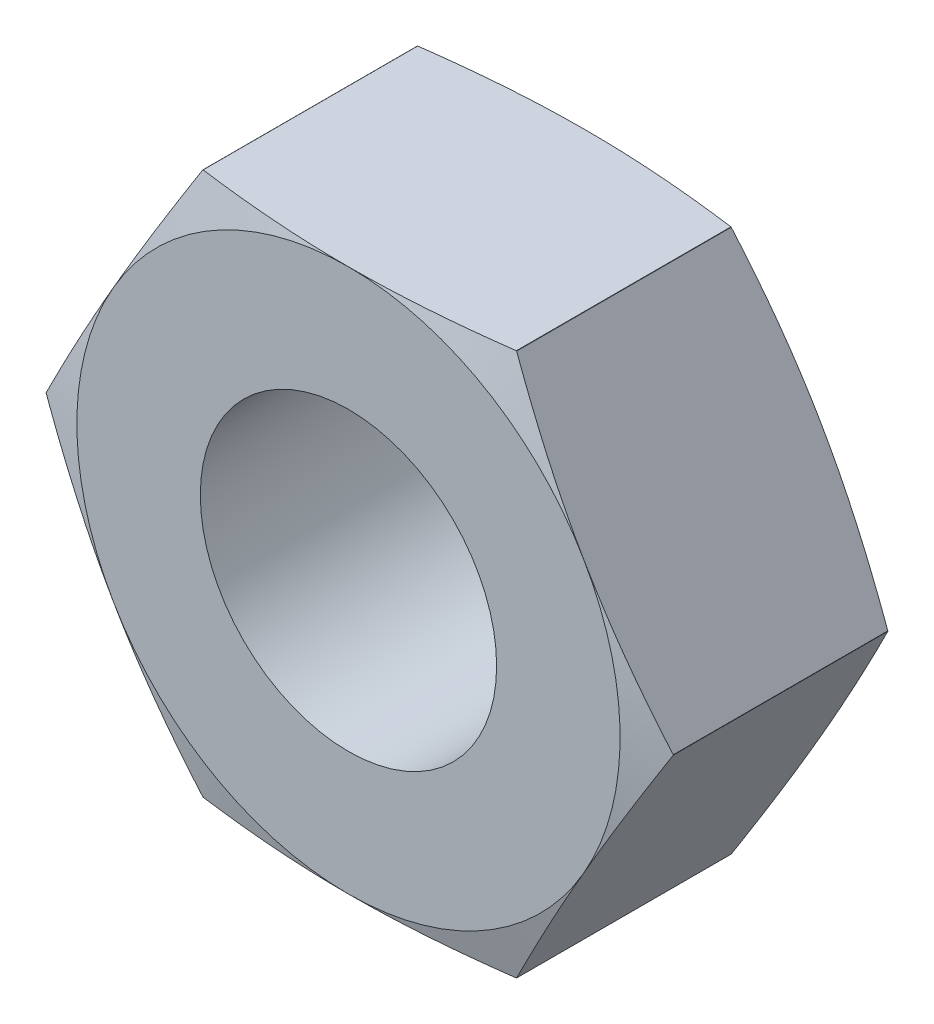
ISO-10303-21;
HEADER;
FILE_DESCRIPTION(('STEP AP214'),'2;1');
FILE_NAME('part.step','',(''),(''),'','','');
FILE_SCHEMA(('AUTOMOTIVE_DESIGN { 1 0 10303 214 1 1 1 1 }'));
ENDSEC;
DATA;
#1=APPLICATION_CONTEXT('core data for automotive mechanical design processes');
#2=APPLICATION_PROTOCOL_DEFINITION('international standard','automotive_design',2000,#1);
#3=PRODUCT_CONTEXT('',#1,'mechanical');
#4=PRODUCT('Part','Part','',(#3));
#5=PRODUCT_RELATED_PRODUCT_CATEGORY('part','',(#4));
#6=PRODUCT_DEFINITION_FORMATION('','',#4);
#7=PRODUCT_DEFINITION_CONTEXT('part definition',#1,'design');
#8=PRODUCT_DEFINITION('design','',#6,#7);
#9=PRODUCT_DEFINITION_SHAPE('','',#8);
#10=(LENGTH_UNIT() NAMED_UNIT(*) SI_UNIT(.MILLI.,.METRE.));
#11=(NAMED_UNIT(*) PLANE_ANGLE_UNIT() SI_UNIT($,.RADIAN.));
#12=(NAMED_UNIT(*) SI_UNIT($,.STERADIAN.) SOLID_ANGLE_UNIT());
#13=UNCERTAINTY_MEASURE_WITH_UNIT(LENGTH_MEASURE(1.E-05),#10,'distance_accuracy_value','');
#14=(GEOMETRIC_REPRESENTATION_CONTEXT(3) GLOBAL_UNCERTAINTY_ASSIGNED_CONTEXT((#13)) GLOBAL_UNIT_ASSIGNED_CONTEXT((#10,
#11,#12)) REPRESENTATION_CONTEXT('',''));
#15=CARTESIAN_POINT('',(0.,0.,0.));
#16=DIRECTION('',(0.,0.,1.));
#17=DIRECTION('',(1.,0.,0.));
#18=AXIS2_PLACEMENT_3D('',#15,#16,#17);
#19=CARTESIAN_POINT('',(0.,0.,-279.2));
#20=DIRECTION('',(0.,0.,-1.));
#21=DIRECTION('',(1.,0.,0.));
#22=AXIS2_PLACEMENT_3D('',#19,#20,#21);
#23=CONICAL_SURFACE('',#22,2.75,1.308408001851);
#24=CARTESIAN_POINT('',(3.17442600725103,0.00173287057355642,-279.313992681729));
#25=CARTESIAN_POINT('',(2.74959778509524,0.73755693583616,-279.199999998947));
#26=CARTESIAN_POINT('',(2.38156985368588,1.37500001164131,-279.199999999914));
#27=(BOUNDED_CURVE() B_SPLINE_CURVE(2,(#24,#25,#26),.UNSPECIFIED.,.F.,
.F.) B_SPLINE_CURVE_WITH_KNOTS((3,3),(0.,1.),
.UNSPECIFIED.) CURVE() GEOMETRIC_REPRESENTATION_ITEM() RATIONAL_B_SPLINE_CURVE((1.,
1.03786726143384,1.)) REPRESENTATION_ITEM(''));
#28=CARTESIAN_POINT('',(3.174426007569,0.001732870021516,-279.3139926819));
#29=VERTEX_POINT('',#28);
#30=CARTESIAN_POINT('',(2.381569853846,1.375000011364,-279.2));
#31=VERTEX_POINT('',#30);
#32=EDGE_CURVE('E403',#29,#31,#27,.T.);
#33=ORIENTED_EDGE('',*,*,#32,.T.);
#34=CARTESIAN_POINT('',(0.,0.,-279.2));
#35=DIRECTION('',(0.,0.,-1.));
#36=DIRECTION('',(0.866025401398437,0.500000004132675,0.));
#37=AXIS2_PLACEMENT_3D('',#34,#35,#36);
#38=CIRCLE('',#37,2.75);
#39=CARTESIAN_POINT('',(2.381569853846,-1.375000011364,-279.2));
#40=VERTEX_POINT('',#39);
#41=EDGE_CURVE('E241',#31,#40,#38,.T.);
#42=ORIENTED_EDGE('',*,*,#41,.T.);
#43=CARTESIAN_POINT('',(2.3815698540061,-1.37500001108668,-279.199999999914));
#44=CARTESIAN_POINT('',(2.74959778543771,-0.737556935242983,-279.199999998994));
#45=CARTESIAN_POINT('',(3.17442600767584,-0.00173286983775878,-279.313992681843));
#46=(BOUNDED_CURVE() B_SPLINE_CURVE(2,(#43,#44,#45),.UNSPECIFIED.,.F.,
.F.) B_SPLINE_CURVE_WITH_KNOTS((3,3),(0.,1.),
.UNSPECIFIED.) CURVE() GEOMETRIC_REPRESENTATION_ITEM() RATIONAL_B_SPLINE_CURVE((1.,
1.03786726143959,1.)) REPRESENTATION_ITEM(''));
#47=CARTESIAN_POINT('',(3.174426007569,-0.00173287002163,-279.3139926819));
#48=VERTEX_POINT('',#47);
#49=EDGE_CURVE('E355',#40,#48,#46,.T.);
#50=ORIENTED_EDGE('',*,*,#49,.T.);
#51=CARTESIAN_POINT('',(0.,0.,-279.3139926819));
#52=DIRECTION('',(0.,0.,-1.));
#53=DIRECTION('',(0.999999851005078,0.000545884439975143,0.));
#54=AXIS2_PLACEMENT_3D('',#51,#52,#53);
#55=CIRCLE('',#54,3.174426480543);
#56=EDGE_CURVE('E391',#29,#48,#55,.T.);
#57=ORIENTED_EDGE('',*,*,#56,.F.);
#58=EDGE_LOOP('',(#33,#42,#50,#57));
#59=FACE_BOUND('',#58,.T.);
#60=ADVANCED_FACE('F16',(#59),#23,.T.);
#61=CARTESIAN_POINT('',(0.,0.,-279.2));
#62=DIRECTION('',(0.,0.,-1.));
#63=DIRECTION('',(1.,0.,0.));
#64=AXIS2_PLACEMENT_3D('',#61,#62,#63);
#65=CONICAL_SURFACE('',#64,2.75,1.308408001851);
#66=CARTESIAN_POINT('',(3.20176115801021E-10,-2.75,-279.199999999914));
#67=CARTESIAN_POINT('',(0.736055857092447,-2.75,-279.199999999937));
#68=CARTESIAN_POINT('',(1.58571229453764,-2.75,-279.313992681843));
#69=(BOUNDED_CURVE() B_SPLINE_CURVE(2,(#66,#67,#68),.UNSPECIFIED.,.F.,
.F.) B_SPLINE_CURVE_WITH_KNOTS((3,3),(0.,1.),
.UNSPECIFIED.) CURVE() GEOMETRIC_REPRESENTATION_ITEM() RATIONAL_B_SPLINE_CURVE((1.,
1.03786726077543,1.)) REPRESENTATION_ITEM(''));
#70=CARTESIAN_POINT('',(0.,-2.75,-279.2));
#71=VERTEX_POINT('',#70);
#72=CARTESIAN_POINT('',(1.585712294325,-2.75,-279.3139926819));
#73=VERTEX_POINT('',#72);
#74=EDGE_CURVE('E311',#71,#73,#69,.T.);
#75=ORIENTED_EDGE('',*,*,#74,.T.);
#76=CARTESIAN_POINT('',(0.,0.,-279.3139926819));
#77=DIRECTION('',(0.,0.,1.));
#78=DIRECTION('',(1.,0.,0.));
#79=AXIS2_PLACEMENT_3D('',#76,#77,#78);
#80=CIRCLE('',#79,3.174426480543);
#81=CARTESIAN_POINT('',(1.588713713245,-2.748267129978,-279.3139926819));
#82=VERTEX_POINT('',#81);
#83=EDGE_CURVE('E11',#73,#82,#80,.T.);
#84=ORIENTED_EDGE('',*,*,#83,.T.);
#85=CARTESIAN_POINT('',(1.5887137135634,-2.74826712942571,-279.313992681729));
#86=CARTESIAN_POINT('',(2.01354192868789,-2.01244307634167,-279.200000000835));
#87=CARTESIAN_POINT('',(2.3815698540061,-1.37500001108668,-279.199999999914));
#88=(BOUNDED_CURVE() B_SPLINE_CURVE(2,(#85,#86,#87),.UNSPECIFIED.,.F.,
.F.) B_SPLINE_CURVE_WITH_KNOTS((3,3),(0.,1.),
.UNSPECIFIED.) CURVE() GEOMETRIC_REPRESENTATION_ITEM() RATIONAL_B_SPLINE_CURVE((1.,
1.03786726011239,1.)) REPRESENTATION_ITEM(''));
#89=EDGE_CURVE('E361',#82,#40,#88,.T.);
#90=ORIENTED_EDGE('',*,*,#89,.T.);
#91=CARTESIAN_POINT('',(0.,0.,-279.2));
#92=DIRECTION('',(0.,0.,1.));
#93=DIRECTION('',(1.,0.,0.));
#94=AXIS2_PLACEMENT_3D('',#91,#92,#93);
#95=CIRCLE('',#94,2.75);
#96=EDGE_CURVE('E238',#71,#40,#95,.T.);
#97=ORIENTED_EDGE('',*,*,#96,.F.);
#98=EDGE_LOOP('',(#75,#84,#90,#97));
#99=FACE_BOUND('',#98,.T.);
#100=ADVANCED_FACE('F578',(#99),#65,.T.);
#101=CARTESIAN_POINT('',(0.,0.,-279.2));
#102=DIRECTION('',(0.,0.,-1.));
#103=DIRECTION('',(1.,0.,0.));
#104=AXIS2_PLACEMENT_3D('',#101,#102,#103);
#105=CONICAL_SURFACE('',#104,2.75,1.308408001851);
#106=CARTESIAN_POINT('',(-2.38156985368546,-1.37500001164206,-279.199999999914));
#107=CARTESIAN_POINT('',(-2.01354192834517,-2.01244307693527,-279.200000000881));
#108=CARTESIAN_POINT('',(-1.58871371313827,-2.74826713016206,-279.313992681843));
#109=(BOUNDED_CURVE() B_SPLINE_CURVE(2,(#106,#107,#108),.UNSPECIFIED.,.F.,
.F.) B_SPLINE_CURVE_WITH_KNOTS((3,3),(0.,1.),
.UNSPECIFIED.) CURVE() GEOMETRIC_REPRESENTATION_ITEM() RATIONAL_B_SPLINE_CURVE((1.,
1.03786726011432,1.)) REPRESENTATION_ITEM(''));
#110=CARTESIAN_POINT('',(-2.381569853846,-1.375000011365,-279.2));
#111=VERTEX_POINT('',#110);
#112=CARTESIAN_POINT('',(-1.588713713245,-2.748267129978,-279.3139926819));
#113=VERTEX_POINT('',#112);
#114=EDGE_CURVE('E326',#111,#113,#109,.T.);
#115=ORIENTED_EDGE('',*,*,#114,.T.);
#116=CARTESIAN_POINT('',(0.,0.,-279.3139926819));
#117=DIRECTION('',(0.,0.,1.));
#118=DIRECTION('',(1.,0.,0.));
#119=AXIS2_PLACEMENT_3D('',#116,#117,#118);
#120=CIRCLE('',#119,3.174426480543);
#121=CARTESIAN_POINT('',(-1.585712294325,-2.75,-279.3139926819));
#122=VERTEX_POINT('',#121);
#123=EDGE_CURVE('E317',#113,#122,#120,.T.);
#124=ORIENTED_EDGE('',*,*,#123,.T.);
#125=CARTESIAN_POINT('',(-1.58571229368776,-2.75,-279.313992681729));
#126=CARTESIAN_POINT('',(-0.7360558564075,-2.75,-279.199999999891));
#127=CARTESIAN_POINT('',(3.20176115801021E-10,-2.75,-279.199999999914));
#128=(BOUNDED_CURVE() B_SPLINE_CURVE(2,(#125,#126,#127),.UNSPECIFIED.,.F.,
.F.) B_SPLINE_CURVE_WITH_KNOTS((3,3),(0.,1.),
.UNSPECIFIED.) CURVE() GEOMETRIC_REPRESENTATION_ITEM() RATIONAL_B_SPLINE_CURVE((1.,
1.0378672607729,1.)) REPRESENTATION_ITEM(''));
#129=EDGE_CURVE('E44',#122,#71,#128,.T.);
#130=ORIENTED_EDGE('',*,*,#129,.T.);
#131=CARTESIAN_POINT('',(0.,0.,-279.2));
#132=DIRECTION('',(0.,0.,1.));
#133=DIRECTION('',(1.,0.,0.));
#134=AXIS2_PLACEMENT_3D('',#131,#132,#133);
#135=CIRCLE('',#134,2.75);
#136=EDGE_CURVE('E224',#111,#71,#135,.T.);
#137=ORIENTED_EDGE('',*,*,#136,.F.);
#138=EDGE_LOOP('',(#115,#124,#130,#137));
#139=FACE_BOUND('',#138,.T.);
#140=ADVANCED_FACE('F581',(#139),#105,.T.);
#141=CARTESIAN_POINT('',(0.,0.,-279.2));
#142=DIRECTION('',(0.,0.,-1.));
#143=DIRECTION('',(1.,0.,0.));
#144=AXIS2_PLACEMENT_3D('',#141,#142,#143);
#145=CONICAL_SURFACE('',#144,2.75,1.308408001851);
#146=CARTESIAN_POINT('',(0.,0.,-279.3139926819));
#147=DIRECTION('',(0.,0.,1.));
#148=DIRECTION('',(1.,0.,0.));
#149=AXIS2_PLACEMENT_3D('',#146,#147,#148);
#150=CIRCLE('',#149,3.174426480543);
#151=CARTESIAN_POINT('',(-3.17442600757,0.001732870021518,-279.3139926819));
#152=VERTEX_POINT('',#151);
#153=CARTESIAN_POINT('',(-3.17442600757,-0.001732870021629,-279.3139926819));
#154=VERTEX_POINT('',#153);
#155=EDGE_CURVE('E496',#152,#154,#150,.T.);
#156=ORIENTED_EDGE('',*,*,#155,.T.);
#157=CARTESIAN_POINT('',(-3.17442600725143,-0.00173287057285742,-279.313992681729));
#158=CARTESIAN_POINT('',(-2.74959778509516,-0.737556935836313,-279.199999998948));
#159=CARTESIAN_POINT('',(-2.38156985368546,-1.37500001164206,-279.199999999914));
#160=(BOUNDED_CURVE() B_SPLINE_CURVE(2,(#157,#158,#159),.UNSPECIFIED.,.F.,
.F.) B_SPLINE_CURVE_WITH_KNOTS((3,3),(0.,1.),
.UNSPECIFIED.) CURVE() GEOMETRIC_REPRESENTATION_ITEM() RATIONAL_B_SPLINE_CURVE((1.,
1.03786726143385,1.)) REPRESENTATION_ITEM(''));
#161=EDGE_CURVE('E219',#154,#111,#160,.T.);
#162=ORIENTED_EDGE('',*,*,#161,.T.);
#163=CARTESIAN_POINT('',(0.,0.,-279.2));
#164=DIRECTION('',(0.,0.,1.));
#165=DIRECTION('',(1.,0.,0.));
#166=AXIS2_PLACEMENT_3D('',#163,#164,#165);
#167=CIRCLE('',#166,2.75);
#168=CARTESIAN_POINT('',(-2.381569860716,1.374999999465,-279.2));
#169=VERTEX_POINT('',#168);
#170=EDGE_CURVE('E217',#169,#111,#167,.T.);
#171=ORIENTED_EDGE('',*,*,#170,.F.);
#172=CARTESIAN_POINT('',(-2.38156986087602,1.37499999918764,-279.199999999914));
#173=CARTESIAN_POINT('',(-2.74959778911882,0.737556928867124,-279.199999999982));
#174=CARTESIAN_POINT('',(-3.17442600767604,0.0017328698374115,-279.313992681843));
#175=(BOUNDED_CURVE() B_SPLINE_CURVE(2,(#172,#173,#174),.UNSPECIFIED.,.F.,
.F.) B_SPLINE_CURVE_WITH_KNOTS((3,3),(0.,1.),
.UNSPECIFIED.) CURVE() GEOMETRIC_REPRESENTATION_ITEM() RATIONAL_B_SPLINE_CURVE((1.,
1.03786726074678,1.)) REPRESENTATION_ITEM(''));
#176=EDGE_CURVE('E203',#169,#152,#175,.T.);
#177=ORIENTED_EDGE('',*,*,#176,.T.);
#178=EDGE_LOOP('',(#156,#162,#171,#177));
#179=FACE_BOUND('',#178,.T.);
#180=ADVANCED_FACE('F218',(#179),#145,.T.);
#181=CARTESIAN_POINT('',(0.,0.,-279.2));
#182=DIRECTION('',(0.,0.,-1.));
#183=DIRECTION('',(1.,0.,0.));
#184=AXIS2_PLACEMENT_3D('',#181,#182,#183);
#185=CONICAL_SURFACE('',#184,2.75,1.308408001851);
#186=CARTESIAN_POINT('',(0.,0.,-279.3139926819));
#187=DIRECTION('',(0.,0.,1.));
#188=DIRECTION('',(1.,0.,0.));
#189=AXIS2_PLACEMENT_3D('',#186,#187,#188);
#190=CIRCLE('',#189,3.174426480543);
#191=CARTESIAN_POINT('',(-1.585712294325,2.75,-279.3139926819));
#192=VERTEX_POINT('',#191);
#193=CARTESIAN_POINT('',(-1.588713713245,2.748267129978,-279.3139926819));
#194=VERTEX_POINT('',#193);
#195=EDGE_CURVE('E197',#192,#194,#190,.T.);
#196=ORIENTED_EDGE('',*,*,#195,.T.);
#197=CARTESIAN_POINT('',(-1.58871371356339,2.74826712942573,-279.313992681729));
#198=CARTESIAN_POINT('',(-2.01354193236891,2.01244306996594,-279.199999999846));
#199=CARTESIAN_POINT('',(-2.38156986087602,1.37499999918764,-279.199999999914));
#200=(BOUNDED_CURVE() B_SPLINE_CURVE(2,(#197,#198,#199),.UNSPECIFIED.,.F.,
.F.) B_SPLINE_CURVE_WITH_KNOTS((3,3),(0.,1.),
.UNSPECIFIED.) CURVE() GEOMETRIC_REPRESENTATION_ITEM() RATIONAL_B_SPLINE_CURVE((1.,
1.03786726080632,1.)) REPRESENTATION_ITEM(''));
#201=EDGE_CURVE('E190',#194,#169,#200,.T.);
#202=ORIENTED_EDGE('',*,*,#201,.T.);
#203=CARTESIAN_POINT('',(0.,0.,-279.2));
#204=DIRECTION('',(0.,0.,1.));
#205=DIRECTION('',(1.,0.,0.));
#206=AXIS2_PLACEMENT_3D('',#203,#204,#205);
#207=CIRCLE('',#206,2.75);
#208=CARTESIAN_POINT('',(-2.997315333326E-13,2.75,-279.2));
#209=VERTEX_POINT('',#208);
#210=EDGE_CURVE('E195',#209,#169,#207,.T.);
#211=ORIENTED_EDGE('',*,*,#210,.F.);
#212=CARTESIAN_POINT('',(-3.20514285748775E-10,2.75,-279.199999999914));
#213=CARTESIAN_POINT('',(-0.736055857092573,2.75,-279.199999999937));
#214=CARTESIAN_POINT('',(-1.58571229453768,2.75,-279.313992681843));
#215=(BOUNDED_CURVE() B_SPLINE_CURVE(2,(#212,#213,#214),.UNSPECIFIED.,.F.,
.F.) B_SPLINE_CURVE_WITH_KNOTS((3,3),(0.,1.),
.UNSPECIFIED.) CURVE() GEOMETRIC_REPRESENTATION_ITEM() RATIONAL_B_SPLINE_CURVE((1.,
1.03786726077567,1.)) REPRESENTATION_ITEM(''));
#216=EDGE_CURVE('E451',#209,#192,#215,.T.);
#217=ORIENTED_EDGE('',*,*,#216,.T.);
#218=EDGE_LOOP('',(#196,#202,#211,#217));
#219=FACE_BOUND('',#218,.T.);
#220=ADVANCED_FACE('F192',(#219),#185,.T.);
#221=CARTESIAN_POINT('',(0.,0.,-279.2));
#222=DIRECTION('',(0.,0.,-1.));
#223=DIRECTION('',(1.,0.,0.));
#224=AXIS2_PLACEMENT_3D('',#221,#222,#223);
#225=CONICAL_SURFACE('',#224,2.75,1.308408001851);
#226=CARTESIAN_POINT('',(0.,0.,-279.3139926819));
#227=DIRECTION('',(0.,0.,1.));
#228=DIRECTION('',(1.,0.,0.));
#229=AXIS2_PLACEMENT_3D('',#226,#227,#228);
#230=CIRCLE('',#229,3.174426480543);
#231=CARTESIAN_POINT('',(1.588713713245,2.748267129978,-279.3139926819));
#232=VERTEX_POINT('',#231);
#233=CARTESIAN_POINT('',(1.585712294325,2.75,-279.3139926819));
#234=VERTEX_POINT('',#233);
#235=EDGE_CURVE('E436',#232,#234,#230,.T.);
#236=ORIENTED_EDGE('',*,*,#235,.T.);
#237=CARTESIAN_POINT('',(1.58571229368788,2.75,-279.313992681729));
#238=CARTESIAN_POINT('',(0.736055856407172,2.75,-279.199999999891));
#239=CARTESIAN_POINT('',(-3.20514285748775E-10,2.75,-279.199999999914));
#240=(BOUNDED_CURVE() B_SPLINE_CURVE(2,(#237,#238,#239),.UNSPECIFIED.,.F.,
.F.) B_SPLINE_CURVE_WITH_KNOTS((3,3),(0.,1.),
.UNSPECIFIED.) CURVE() GEOMETRIC_REPRESENTATION_ITEM() RATIONAL_B_SPLINE_CURVE((1.,
1.03786726077453,1.)) REPRESENTATION_ITEM(''));
#241=EDGE_CURVE('E456',#234,#209,#240,.T.);
#242=ORIENTED_EDGE('',*,*,#241,.T.);
#243=CARTESIAN_POINT('',(0.,0.,-279.2));
#244=DIRECTION('',(0.,0.,1.));
#245=DIRECTION('',(1.,0.,0.));
#246=AXIS2_PLACEMENT_3D('',#243,#244,#245);
#247=CIRCLE('',#246,2.75);
#248=EDGE_CURVE('E229',#31,#209,#247,.T.);
#249=ORIENTED_EDGE('',*,*,#248,.F.);
#250=CARTESIAN_POINT('',(2.38156985368588,1.37500001164131,-279.199999999914));
#251=CARTESIAN_POINT('',(2.0135419283454,2.01244307693487,-279.20000000088));
#252=CARTESIAN_POINT('',(1.58871371313827,2.74826713016205,-279.313992681843));
#253=(BOUNDED_CURVE() B_SPLINE_CURVE(2,(#250,#251,#252),.UNSPECIFIED.,.F.,
.F.) B_SPLINE_CURVE_WITH_KNOTS((3,3),(0.,1.),
.UNSPECIFIED.) CURVE() GEOMETRIC_REPRESENTATION_ITEM() RATIONAL_B_SPLINE_CURVE((1.,
1.0378672601165,1.)) REPRESENTATION_ITEM(''));
#254=EDGE_CURVE('E397',#31,#232,#253,.T.);
#255=ORIENTED_EDGE('',*,*,#254,.T.);
#256=EDGE_LOOP('',(#236,#242,#249,#255));
#257=FACE_BOUND('',#256,.T.);
#258=ADVANCED_FACE('F613',(#257),#225,.T.);
#259=CARTESIAN_POINT('',(0.,0.,-281.4860073181));
#260=DIRECTION('',(0.,0.,1.));
#261=DIRECTION('',(1.,0.,0.));
#262=AXIS2_PLACEMENT_3D('',#259,#260,#261);
#263=CONICAL_SURFACE('',#262,3.174426480543,1.308408001851);
#264=CARTESIAN_POINT('',(2.38156985381986,1.37500001140927,-281.599999999986));
#265=CARTESIAN_POINT('',(2.74959778528795,0.73755693550237,-281.600000000933));
#266=CARTESIAN_POINT('',(3.17442600755167,0.00173287005282896,-281.48600731809));
#267=(BOUNDED_CURVE() B_SPLINE_CURVE(2,(#264,#265,#266),.UNSPECIFIED.,.F.,
.F.) B_SPLINE_CURVE_WITH_KNOTS((3,3),(0.,1.),
.UNSPECIFIED.) CURVE() GEOMETRIC_REPRESENTATION_ITEM() RATIONAL_B_SPLINE_CURVE((1.,
1.03786726144963,1.)) REPRESENTATION_ITEM(''));
#268=CARTESIAN_POINT('',(2.381569853846,1.375000011364,-281.6));
#269=VERTEX_POINT('',#268);
#270=CARTESIAN_POINT('',(3.174426007569,0.001732870021516,-281.4860073181));
#271=VERTEX_POINT('',#270);
#272=EDGE_CURVE('E411',#269,#271,#267,.T.);
#273=ORIENTED_EDGE('',*,*,#272,.T.);
#274=CARTESIAN_POINT('',(0.,0.,-281.4860073181));
#275=DIRECTION('',(0.,0.,-1.));
#276=DIRECTION('',(0.999999851005078,0.000545884439975143,0.));
#277=AXIS2_PLACEMENT_3D('',#274,#275,#276);
#278=CIRCLE('',#277,3.174426480543);
#279=CARTESIAN_POINT('',(3.174426007569,-0.001732870021631,-281.4860073181));
#280=VERTEX_POINT('',#279);
#281=EDGE_CURVE('E394',#271,#280,#278,.T.);
#282=ORIENTED_EDGE('',*,*,#281,.T.);
#283=CARTESIAN_POINT('',(3.17442600762307,-0.001732869929165,-281.486007318071));
#284=CARTESIAN_POINT('',(2.74959778534468,-0.737556935404121,-281.600000000926));
#285=CARTESIAN_POINT('',(2.38156985387214,-1.37500001131872,-281.599999999986));
#286=(BOUNDED_CURVE() B_SPLINE_CURVE(2,(#283,#284,#285),.UNSPECIFIED.,.F.,
.F.) B_SPLINE_CURVE_WITH_KNOTS((3,3),(0.,1.),
.UNSPECIFIED.) CURVE() GEOMETRIC_REPRESENTATION_ITEM() RATIONAL_B_SPLINE_CURVE((1.,
1.03786726144915,1.)) REPRESENTATION_ITEM(''));
#287=CARTESIAN_POINT('',(2.381569853846,-1.375000011364,-281.6));
#288=VERTEX_POINT('',#287);
#289=EDGE_CURVE('E375',#280,#288,#286,.T.);
#290=ORIENTED_EDGE('',*,*,#289,.T.);
#291=CARTESIAN_POINT('',(0.,0.,-281.6));
#292=DIRECTION('',(0.,0.,1.));
#293=DIRECTION('',(0.866025401398437,-0.500000004132675,0.));
#294=AXIS2_PLACEMENT_3D('',#291,#292,#293);
#295=CIRCLE('',#294,2.75);
#296=EDGE_CURVE('E310',#288,#269,#295,.T.);
#297=ORIENTED_EDGE('',*,*,#296,.T.);
#298=EDGE_LOOP('',(#273,#282,#290,#297));
#299=FACE_BOUND('',#298,.T.);
#300=ADVANCED_FACE('F567',(#299),#263,.T.);
#301=CARTESIAN_POINT('',(0.,0.,-281.4860073181));
#302=DIRECTION('',(0.,0.,1.));
#303=DIRECTION('',(1.,0.,0.));
#304=AXIS2_PLACEMENT_3D('',#301,#302,#303);
#305=CONICAL_SURFACE('',#304,3.174426480543,1.308408001851);
#306=CARTESIAN_POINT('',(0.,0.,-281.6));
#307=DIRECTION('',(0.,0.,1.));
#308=DIRECTION('',(1.,0.,0.));
#309=AXIS2_PLACEMENT_3D('',#306,#307,#308);
#310=CIRCLE('',#309,2.75);
#311=CARTESIAN_POINT('',(-3.002644403844E-13,2.75,-281.6));
#312=VERTEX_POINT('',#311);
#313=EDGE_CURVE('E273',#269,#312,#310,.T.);
#314=ORIENTED_EDGE('',*,*,#313,.T.);
#315=CARTESIAN_POINT('',(-5.25790895159364E-11,2.75,-281.599999999986));
#316=CARTESIAN_POINT('',(0.736055856792699,2.75,-281.59999999999));
#317=CARTESIAN_POINT('',(1.58571229428923,2.75,-281.48600731809));
#318=(BOUNDED_CURVE() B_SPLINE_CURVE(2,(#315,#316,#317),.UNSPECIFIED.,.F.,
.F.) B_SPLINE_CURVE_WITH_KNOTS((3,3),(0.,1.),
.UNSPECIFIED.) CURVE() GEOMETRIC_REPRESENTATION_ITEM() RATIONAL_B_SPLINE_CURVE((1.,
1.03786726078566,1.)) REPRESENTATION_ITEM(''));
#319=CARTESIAN_POINT('',(1.585712294325,2.75,-281.4860073181));
#320=VERTEX_POINT('',#319);
#321=EDGE_CURVE('E464',#312,#320,#318,.T.);
#322=ORIENTED_EDGE('',*,*,#321,.T.);
#323=CARTESIAN_POINT('',(0.,0.,-281.4860073181));
#324=DIRECTION('',(0.,0.,1.));
#325=DIRECTION('',(1.,0.,0.));
#326=AXIS2_PLACEMENT_3D('',#323,#324,#325);
#327=CIRCLE('',#326,3.174426480543);
#328=CARTESIAN_POINT('',(1.588713713245,2.748267129978,-281.4860073181));
#329=VERTEX_POINT('',#328);
#330=EDGE_CURVE('E285',#329,#320,#327,.T.);
#331=ORIENTED_EDGE('',*,*,#330,.F.);
#332=CARTESIAN_POINT('',(1.58871371319125,2.74826713007029,-281.486007318071));
#333=CARTESIAN_POINT('',(2.01354192843851,2.01244307677359,-281.599999999039));
#334=CARTESIAN_POINT('',(2.38156985381986,1.37500001140927,-281.599999999986));
#335=(BOUNDED_CURVE() B_SPLINE_CURVE(2,(#332,#333,#334),.UNSPECIFIED.,.F.,
.F.) B_SPLINE_CURVE_WITH_KNOTS((3,3),(0.,1.),
.UNSPECIFIED.) CURVE() GEOMETRIC_REPRESENTATION_ITEM() RATIONAL_B_SPLINE_CURVE((1.,
1.03786726012493,1.)) REPRESENTATION_ITEM(''));
#336=EDGE_CURVE('E419',#329,#269,#335,.T.);
#337=ORIENTED_EDGE('',*,*,#336,.T.);
#338=EDGE_LOOP('',(#314,#322,#331,#337));
#339=FACE_BOUND('',#338,.T.);
#340=ADVANCED_FACE('F601',(#339),#305,.T.);
#341=CARTESIAN_POINT('',(0.,0.,-281.4860073181));
#342=DIRECTION('',(0.,0.,1.));
#343=DIRECTION('',(1.,0.,0.));
#344=AXIS2_PLACEMENT_3D('',#341,#342,#343);
#345=CONICAL_SURFACE('',#344,3.174426480543,1.308408001851);
#346=CARTESIAN_POINT('',(-2.38156986074205,1.37499999941967,-281.599999999986));
#347=CARTESIAN_POINT('',(-2.01354193217604,2.01244307030002,-281.600000000034));
#348=CARTESIAN_POINT('',(-1.58871371326247,2.74826712994693,-281.48600731809));
#349=(BOUNDED_CURVE() B_SPLINE_CURVE(2,(#346,#347,#348),.UNSPECIFIED.,.F.,
.F.) B_SPLINE_CURVE_WITH_KNOTS((3,3),(0.,1.),
.UNSPECIFIED.) CURVE() GEOMETRIC_REPRESENTATION_ITEM() RATIONAL_B_SPLINE_CURVE((1.,
1.03786726081841,1.)) REPRESENTATION_ITEM(''));
#350=CARTESIAN_POINT('',(-2.381569860716,1.374999999465,-281.6));
#351=VERTEX_POINT('',#350);
#352=CARTESIAN_POINT('',(-1.588713713245,2.748267129978,-281.4860073181));
#353=VERTEX_POINT('',#352);
#354=EDGE_CURVE('E202',#351,#353,#349,.T.);
#355=ORIENTED_EDGE('',*,*,#354,.T.);
#356=CARTESIAN_POINT('',(0.,0.,-281.4860073181));
#357=DIRECTION('',(0.,0.,1.));
#358=DIRECTION('',(1.,0.,0.));
#359=AXIS2_PLACEMENT_3D('',#356,#357,#358);
#360=CIRCLE('',#359,3.174426480543);
#361=CARTESIAN_POINT('',(-1.585712294325,2.75,-281.4860073181));
#362=VERTEX_POINT('',#361);
#363=EDGE_CURVE('E447',#362,#353,#360,.T.);
#364=ORIENTED_EDGE('',*,*,#363,.F.);
#365=CARTESIAN_POINT('',(-1.58571229443205,2.75,-281.486007318071));
#366=CARTESIAN_POINT('',(-0.736055856906394,2.75,-281.599999999982));
#367=CARTESIAN_POINT('',(-5.25790895159364E-11,2.75,-281.599999999986));
#368=(BOUNDED_CURVE() B_SPLINE_CURVE(2,(#365,#366,#367),.UNSPECIFIED.,.F.,
.F.) B_SPLINE_CURVE_WITH_KNOTS((3,3),(0.,1.),
.UNSPECIFIED.) CURVE() GEOMETRIC_REPRESENTATION_ITEM() RATIONAL_B_SPLINE_CURVE((1.,
1.03786726078543,1.)) REPRESENTATION_ITEM(''));
#369=EDGE_CURVE('E472',#362,#312,#368,.T.);
#370=ORIENTED_EDGE('',*,*,#369,.T.);
#371=CARTESIAN_POINT('',(0.,0.,-281.6));
#372=DIRECTION('',(0.,0.,1.));
#373=DIRECTION('',(1.,0.,0.));
#374=AXIS2_PLACEMENT_3D('',#371,#372,#373);
#375=CIRCLE('',#374,2.75);
#376=EDGE_CURVE('E266',#312,#351,#375,.T.);
#377=ORIENTED_EDGE('',*,*,#376,.T.);
#378=EDGE_LOOP('',(#355,#364,#370,#377));
#379=FACE_BOUND('',#378,.T.);
#380=ADVANCED_FACE('F592',(#379),#345,.T.);
#381=CARTESIAN_POINT('',(0.,0.,-281.4860073181));
#382=DIRECTION('',(0.,0.,1.));
#383=DIRECTION('',(1.,0.,0.));
#384=AXIS2_PLACEMENT_3D('',#381,#382,#383);
#385=CONICAL_SURFACE('',#384,3.174426480543,1.308408001851);
#386=CARTESIAN_POINT('',(-2.38156985381942,-1.37500001141002,-281.599999999986));
#387=CARTESIAN_POINT('',(-2.74959778528769,-0.737556935502814,-281.600000000933));
#388=CARTESIAN_POINT('',(-3.1744260075518,-0.0017328700525947,-281.48600731809));
#389=(BOUNDED_CURVE() B_SPLINE_CURVE(2,(#386,#387,#388),.UNSPECIFIED.,.F.,
.F.) B_SPLINE_CURVE_WITH_KNOTS((3,3),(0.,1.),
.UNSPECIFIED.) CURVE() GEOMETRIC_REPRESENTATION_ITEM() RATIONAL_B_SPLINE_CURVE((1.,
1.03786726144891,1.)) REPRESENTATION_ITEM(''));
#390=CARTESIAN_POINT('',(-2.381569853846,-1.375000011365,-281.6));
#391=VERTEX_POINT('',#390);
#392=CARTESIAN_POINT('',(-3.17442600757,-0.001732870021629,-281.4860073181));
#393=VERTEX_POINT('',#392);
#394=EDGE_CURVE('E325',#391,#393,#389,.T.);
#395=ORIENTED_EDGE('',*,*,#394,.T.);
#396=CARTESIAN_POINT('',(0.,0.,-281.4860073181));
#397=DIRECTION('',(0.,0.,1.));
#398=DIRECTION('',(1.,0.,0.));
#399=AXIS2_PLACEMENT_3D('',#396,#397,#398);
#400=CIRCLE('',#399,3.174426480543);
#401=CARTESIAN_POINT('',(-3.17442600757,0.001732870021518,-281.4860073181));
#402=VERTEX_POINT('',#401);
#403=EDGE_CURVE('E523',#402,#393,#400,.T.);
#404=ORIENTED_EDGE('',*,*,#403,.F.);
#405=CARTESIAN_POINT('',(-3.17442600762367,0.00173286992811983,-281.486007318071));
#406=CARTESIAN_POINT('',(-2.74959778902593,0.737556929027999,-281.599999999938));
#407=CARTESIAN_POINT('',(-2.38156986074205,1.37499999941967,-281.599999999986));
#408=(BOUNDED_CURVE() B_SPLINE_CURVE(2,(#405,#406,#407),.UNSPECIFIED.,.F.,
.F.) B_SPLINE_CURVE_WITH_KNOTS((3,3),(0.,1.),
.UNSPECIFIED.) CURVE() GEOMETRIC_REPRESENTATION_ITEM() RATIONAL_B_SPLINE_CURVE((1.,
1.03786726075411,1.)) REPRESENTATION_ITEM(''));
#409=EDGE_CURVE('E252',#402,#351,#408,.T.);
#410=ORIENTED_EDGE('',*,*,#409,.T.);
#411=CARTESIAN_POINT('',(0.,0.,-281.6));
#412=DIRECTION('',(0.,0.,1.));
#413=DIRECTION('',(1.,0.,0.));
#414=AXIS2_PLACEMENT_3D('',#411,#412,#413);
#415=CIRCLE('',#414,2.75);
#416=EDGE_CURVE('E274',#351,#391,#415,.T.);
#417=ORIENTED_EDGE('',*,*,#416,.T.);
#418=EDGE_LOOP('',(#395,#404,#410,#417));
#419=FACE_BOUND('',#418,.T.);
#420=ADVANCED_FACE('F589',(#419),#385,.T.);
#421=CARTESIAN_POINT('',(0.,0.,-281.4860073181));
#422=DIRECTION('',(0.,0.,1.));
#423=DIRECTION('',(1.,0.,0.));
#424=AXIS2_PLACEMENT_3D('',#421,#422,#423);
#425=CONICAL_SURFACE('',#424,3.174426480543,1.308408001851);
#426=CARTESIAN_POINT('',(0.,0.,-281.4860073181));
#427=DIRECTION('',(0.,0.,1.));
#428=DIRECTION('',(1.,0.,0.));
#429=AXIS2_PLACEMENT_3D('',#426,#427,#428);
#430=CIRCLE('',#429,3.174426480543);
#431=CARTESIAN_POINT('',(-1.588713713245,-2.748267129978,-281.4860073181));
#432=VERTEX_POINT('',#431);
#433=CARTESIAN_POINT('',(-1.585712294325,-2.75,-281.4860073181));
#434=VERTEX_POINT('',#433);
#435=EDGE_CURVE('E245',#432,#434,#430,.T.);
#436=ORIENTED_EDGE('',*,*,#435,.F.);
#437=CARTESIAN_POINT('',(-1.58871371319125,-2.74826713007029,-281.486007318071));
#438=CARTESIAN_POINT('',(-2.01354192843828,-2.012443076774,-281.599999999039));
#439=CARTESIAN_POINT('',(-2.38156985381942,-1.37500001141002,-281.599999999986));
#440=(BOUNDED_CURVE() B_SPLINE_CURVE(2,(#437,#438,#439),.UNSPECIFIED.,.F.,
.F.) B_SPLINE_CURVE_WITH_KNOTS((3,3),(0.,1.),
.UNSPECIFIED.) CURVE() GEOMETRIC_REPRESENTATION_ITEM() RATIONAL_B_SPLINE_CURVE((1.,
1.03786726012272,1.)) REPRESENTATION_ITEM(''));
#441=EDGE_CURVE('E246',#432,#391,#440,.T.);
#442=ORIENTED_EDGE('',*,*,#441,.T.);
#443=CARTESIAN_POINT('',(0.,0.,-281.6));
#444=DIRECTION('',(0.,0.,1.));
#445=DIRECTION('',(1.,0.,0.));
#446=AXIS2_PLACEMENT_3D('',#443,#444,#445);
#447=CIRCLE('',#446,2.75);
#448=CARTESIAN_POINT('',(0.,-2.75,-281.6));
#449=VERTEX_POINT('',#448);
#450=EDGE_CURVE('E283',#391,#449,#447,.T.);
#451=ORIENTED_EDGE('',*,*,#450,.T.);
#452=CARTESIAN_POINT('',(5.22410749993762E-11,-2.75,-281.599999999986));
#453=CARTESIAN_POINT('',(-0.736055856792829,-2.75,-281.59999999999));
#454=CARTESIAN_POINT('',(-1.58571229428927,-2.75,-281.48600731809));
#455=(BOUNDED_CURVE() B_SPLINE_CURVE(2,(#452,#453,#454),.UNSPECIFIED.,.F.,
.F.) B_SPLINE_CURVE_WITH_KNOTS((3,3),(0.,1.),
.UNSPECIFIED.) CURVE() GEOMETRIC_REPRESENTATION_ITEM() RATIONAL_B_SPLINE_CURVE((1.,
1.03786726078587,1.)) REPRESENTATION_ITEM(''));
#456=EDGE_CURVE('E299',#449,#434,#455,.T.);
#457=ORIENTED_EDGE('',*,*,#456,.T.);
#458=EDGE_LOOP('',(#436,#442,#451,#457));
#459=FACE_BOUND('',#458,.T.);
#460=ADVANCED_FACE('F555',(#459),#425,.T.);
#461=CARTESIAN_POINT('',(0.,0.,-279.3139926819));
#462=DIRECTION('',(0.,0.,-1.));
#463=DIRECTION('',(1.,0.,0.));
#464=AXIS2_PLACEMENT_3D('',#461,#462,#463);
#465=CYLINDRICAL_SURFACE('',#464,3.174426480543);
#466=DIRECTION('',(0.,0.,-1.));
#467=VECTOR('',#466,1.);
#468=CARTESIAN_POINT('',(1.585712294325,-2.75,-279.3139926819));
#469=LINE('',#468,#467);
#470=CARTESIAN_POINT('',(1.585712294325,-2.75,-281.4860073181));
#471=VERTEX_POINT('',#470);
#472=EDGE_CURVE('E24',#73,#471,#469,.T.);
#473=ORIENTED_EDGE('',*,*,#472,.T.);
#474=CARTESIAN_POINT('',(0.,0.,-281.4860073181));
#475=DIRECTION('',(0.,0.,1.));
#476=DIRECTION('',(1.,0.,0.));
#477=AXIS2_PLACEMENT_3D('',#474,#475,#476);
#478=CIRCLE('',#477,3.174426480543);
#479=CARTESIAN_POINT('',(1.588713713245,-2.748267129978,-281.4860073181));
#480=VERTEX_POINT('',#479);
#481=EDGE_CURVE('E348',#471,#480,#478,.T.);
#482=ORIENTED_EDGE('',*,*,#481,.T.);
#483=DIRECTION('',(0.,0.,-1.));
#484=VECTOR('',#483,1.);
#485=CARTESIAN_POINT('',(1.588713713245,-2.748267129978,-279.3139926819));
#486=LINE('',#485,#484);
#487=EDGE_CURVE('E369',#82,#480,#486,.T.);
#488=ORIENTED_EDGE('',*,*,#487,.F.);
#489=ORIENTED_EDGE('',*,*,#83,.F.);
#490=EDGE_LOOP('',(#473,#482,#488,#489));
#491=FACE_BOUND('',#490,.T.);
#492=ADVANCED_FACE('F547',(#491),#465,.T.);
#493=CARTESIAN_POINT('',(-1.587713240272,-2.75,-279.2));
#494=DIRECTION('',(0.,1.,0.));
#495=DIRECTION('',(0.,0.,-1.));
#496=AXIS2_PLACEMENT_3D('',#493,#494,#495);
#497=PLANE('',#496);
#498=ORIENTED_EDGE('',*,*,#74,.F.);
#499=ORIENTED_EDGE('',*,*,#129,.F.);
#500=DIRECTION('',(0.,0.,-1.));
#501=VECTOR('',#500,1.);
#502=CARTESIAN_POINT('',(-1.585712294325,-2.75,-279.3139926819));
#503=LINE('',#502,#501);
#504=EDGE_CURVE('E513',#122,#434,#503,.T.);
#505=ORIENTED_EDGE('',*,*,#504,.T.);
#506=ORIENTED_EDGE('',*,*,#456,.F.);
#507=CARTESIAN_POINT('',(1.58571229443216,-2.75,-281.486007318071));
#508=CARTESIAN_POINT('',(0.736055856906472,-2.75,-281.599999999983));
#509=CARTESIAN_POINT('',(5.22410749993762E-11,-2.75,-281.599999999986));
#510=(BOUNDED_CURVE() B_SPLINE_CURVE(2,(#507,#508,#509),.UNSPECIFIED.,.F.,
.F.) B_SPLINE_CURVE_WITH_KNOTS((3,3),(0.,1.),
.UNSPECIFIED.) CURVE() GEOMETRIC_REPRESENTATION_ITEM() RATIONAL_B_SPLINE_CURVE((1.,
1.03786726078479,1.)) REPRESENTATION_ITEM(''));
#511=EDGE_CURVE('E333',#471,#449,#510,.T.);
#512=ORIENTED_EDGE('',*,*,#511,.F.);
#513=ORIENTED_EDGE('',*,*,#472,.F.);
#514=EDGE_LOOP('',(#498,#499,#505,#506,#512,#513));
#515=FACE_BOUND('',#514,.T.);
#516=ADVANCED_FACE('F552',(#515),#497,.F.);
#517=CARTESIAN_POINT('',(0.,0.,-279.3139926819));
#518=DIRECTION('',(0.,0.,-1.));
#519=DIRECTION('',(1.,0.,0.));
#520=AXIS2_PLACEMENT_3D('',#517,#518,#519);
#521=CYLINDRICAL_SURFACE('',#520,3.174426480543);
#522=DIRECTION('',(0.,0.,-1.));
#523=VECTOR('',#522,1.);
#524=CARTESIAN_POINT('',(-1.588713713245,-2.748267129978,-279.3139926819));
#525=LINE('',#524,#523);
#526=EDGE_CURVE('E242',#113,#432,#525,.T.);
#527=ORIENTED_EDGE('',*,*,#526,.T.);
#528=ORIENTED_EDGE('',*,*,#435,.T.);
#529=ORIENTED_EDGE('',*,*,#504,.F.);
#530=ORIENTED_EDGE('',*,*,#123,.F.);
#531=EDGE_LOOP('',(#527,#528,#529,#530));
#532=FACE_BOUND('',#531,.T.);
#533=ADVANCED_FACE('F584',(#532),#521,.T.);
#534=CARTESIAN_POINT('',(-3.175426480543,0.,-279.2));
#535=DIRECTION('',(0.866025403784329,0.50000000000019,0.));
#536=DIRECTION('',(0.,0.,-1.));
#537=AXIS2_PLACEMENT_3D('',#534,#535,#536);
#538=PLANE('',#537);
#539=ORIENTED_EDGE('',*,*,#114,.F.);
#540=ORIENTED_EDGE('',*,*,#161,.F.);
#541=DIRECTION('',(0.,0.,-1.));
#542=VECTOR('',#541,1.);
#543=CARTESIAN_POINT('',(-3.17442600757,-0.00173287002163,-279.3139926819));
#544=LINE('',#543,#542);
#545=EDGE_CURVE('E527',#154,#393,#544,.T.);
#546=ORIENTED_EDGE('',*,*,#545,.T.);
#547=ORIENTED_EDGE('',*,*,#394,.F.);
#548=ORIENTED_EDGE('',*,*,#441,.F.);
#549=ORIENTED_EDGE('',*,*,#526,.F.);
#550=EDGE_LOOP('',(#539,#540,#546,#547,#548,#549));
#551=FACE_BOUND('',#550,.T.);
#552=ADVANCED_FACE('F586',(#551),#538,.F.);
#553=CARTESIAN_POINT('',(0.,0.,-279.3139926819));
#554=DIRECTION('',(0.,0.,-1.));
#555=DIRECTION('',(1.,0.,0.));
#556=AXIS2_PLACEMENT_3D('',#553,#554,#555);
#557=CYLINDRICAL_SURFACE('',#556,3.174426480543);
#558=ORIENTED_EDGE('',*,*,#403,.T.);
#559=ORIENTED_EDGE('',*,*,#545,.F.);
#560=ORIENTED_EDGE('',*,*,#155,.F.);
#561=DIRECTION('',(0.,0.,-1.));
#562=VECTOR('',#561,1.);
#563=CARTESIAN_POINT('',(-3.17442600757,0.001732870021518,-279.3139926819));
#564=LINE('',#563,#562);
#565=EDGE_CURVE('E211',#152,#402,#564,.T.);
#566=ORIENTED_EDGE('',*,*,#565,.T.);
#567=EDGE_LOOP('',(#558,#559,#560,#566));
#568=FACE_BOUND('',#567,.T.);
#569=ADVANCED_FACE('F625',(#568),#557,.T.);
#570=CARTESIAN_POINT('',(-1.587713240272,2.75,-279.2));
#571=DIRECTION('',(0.866025403784329,-0.50000000000019,0.));
#572=DIRECTION('',(0.,0.,-1.));
#573=AXIS2_PLACEMENT_3D('',#570,#571,#572);
#574=PLANE('',#573);
#575=ORIENTED_EDGE('',*,*,#176,.F.);
#576=ORIENTED_EDGE('',*,*,#201,.F.);
#577=DIRECTION('',(0.,0.,-1.));
#578=VECTOR('',#577,1.);
#579=CARTESIAN_POINT('',(-1.588713713245,2.748267129978,-279.3139926819));
#580=LINE('',#579,#578);
#581=EDGE_CURVE('E441',#194,#353,#580,.T.);
#582=ORIENTED_EDGE('',*,*,#581,.T.);
#583=ORIENTED_EDGE('',*,*,#354,.F.);
#584=ORIENTED_EDGE('',*,*,#409,.F.);
#585=ORIENTED_EDGE('',*,*,#565,.F.);
#586=EDGE_LOOP('',(#575,#576,#582,#583,#584,#585));
#587=FACE_BOUND('',#586,.T.);
#588=ADVANCED_FACE('F208',(#587),#574,.F.);
#589=CARTESIAN_POINT('',(0.,0.,-279.3139926819));
#590=DIRECTION('',(0.,0.,-1.));
#591=DIRECTION('',(1.,0.,0.));
#592=AXIS2_PLACEMENT_3D('',#589,#590,#591);
#593=CYLINDRICAL_SURFACE('',#592,3.174426480543);
#594=ORIENTED_EDGE('',*,*,#363,.T.);
#595=ORIENTED_EDGE('',*,*,#581,.F.);
#596=ORIENTED_EDGE('',*,*,#195,.F.);
#597=DIRECTION('',(0.,0.,-1.));
#598=VECTOR('',#597,1.);
#599=CARTESIAN_POINT('',(-1.585712294325,2.75,-279.3139926819));
#600=LINE('',#599,#598);
#601=EDGE_CURVE('E480',#192,#362,#600,.T.);
#602=ORIENTED_EDGE('',*,*,#601,.T.);
#603=EDGE_LOOP('',(#594,#595,#596,#602));
#604=FACE_BOUND('',#603,.T.);
#605=ADVANCED_FACE('F615',(#604),#593,.T.);
#606=CARTESIAN_POINT('',(1.587713240271,2.75,-279.2));
#607=DIRECTION('',(0.,-1.,0.));
#608=DIRECTION('',(-1.,0.,0.));
#609=AXIS2_PLACEMENT_3D('',#606,#607,#608);
#610=PLANE('',#609);
#611=ORIENTED_EDGE('',*,*,#216,.F.);
#612=ORIENTED_EDGE('',*,*,#241,.F.);
#613=DIRECTION('',(0.,0.,-1.));
#614=VECTOR('',#613,1.);
#615=CARTESIAN_POINT('',(1.585712294325,2.75,-279.3139926819));
#616=LINE('',#615,#614);
#617=EDGE_CURVE('E289',#234,#320,#616,.T.);
#618=ORIENTED_EDGE('',*,*,#617,.T.);
#619=ORIENTED_EDGE('',*,*,#321,.F.);
#620=ORIENTED_EDGE('',*,*,#369,.F.);
#621=ORIENTED_EDGE('',*,*,#601,.F.);
#622=EDGE_LOOP('',(#611,#612,#618,#619,#620,#621));
#623=FACE_BOUND('',#622,.T.);
#624=ADVANCED_FACE('F598',(#623),#610,.F.);
#625=CARTESIAN_POINT('',(0.,0.,-279.3139926819));
#626=DIRECTION('',(0.,0.,-1.));
#627=DIRECTION('',(1.,0.,0.));
#628=AXIS2_PLACEMENT_3D('',#625,#626,#627);
#629=CYLINDRICAL_SURFACE('',#628,3.174426480543);
#630=ORIENTED_EDGE('',*,*,#330,.T.);
#631=ORIENTED_EDGE('',*,*,#617,.F.);
#632=ORIENTED_EDGE('',*,*,#235,.F.);
#633=DIRECTION('',(0.,0.,-1.));
#634=VECTOR('',#633,1.);
#635=CARTESIAN_POINT('',(1.588713713245,2.748267129978,-279.3139926819));
#636=LINE('',#635,#634);
#637=EDGE_CURVE('E290',#232,#329,#636,.T.);
#638=ORIENTED_EDGE('',*,*,#637,.T.);
#639=EDGE_LOOP('',(#630,#631,#632,#638));
#640=FACE_BOUND('',#639,.T.);
#641=ADVANCED_FACE('F623',(#640),#629,.T.);
#642=CARTESIAN_POINT('',(3.175426480543,0.,-279.2));
#643=DIRECTION('',(-0.866025403784329,-0.50000000000019,0.));
#644=DIRECTION('',(-0.50000000000019,0.866025403784329,0.));
#645=AXIS2_PLACEMENT_3D('',#642,#643,#644);
#646=PLANE('',#645);
#647=ORIENTED_EDGE('',*,*,#254,.F.);
#648=ORIENTED_EDGE('',*,*,#32,.F.);
#649=DIRECTION('',(0.,0.,-1.));
#650=VECTOR('',#649,1.);
#651=CARTESIAN_POINT('',(3.174426007569,0.001732870021516,-279.3139926819));
#652=LINE('',#651,#650);
#653=EDGE_CURVE('E387',#29,#271,#652,.T.);
#654=ORIENTED_EDGE('',*,*,#653,.T.);
#655=ORIENTED_EDGE('',*,*,#272,.F.);
#656=ORIENTED_EDGE('',*,*,#336,.F.);
#657=ORIENTED_EDGE('',*,*,#637,.F.);
#658=EDGE_LOOP('',(#647,#648,#654,#655,#656,#657));
#659=FACE_BOUND('',#658,.T.);
#660=ADVANCED_FACE('F606',(#659),#646,.F.);
#661=CARTESIAN_POINT('',(0.,0.,-279.3139926819));
#662=DIRECTION('',(0.,0.,-1.));
#663=DIRECTION('',(1.,0.,0.));
#664=AXIS2_PLACEMENT_3D('',#661,#662,#663);
#665=CYLINDRICAL_SURFACE('',#664,3.174426480543);
#666=ORIENTED_EDGE('',*,*,#653,.F.);
#667=ORIENTED_EDGE('',*,*,#56,.T.);
#668=DIRECTION('',(0.,0.,-1.));
#669=VECTOR('',#668,1.);
#670=CARTESIAN_POINT('',(3.174426007569,-0.00173287002163,-279.3139926819));
#671=LINE('',#670,#669);
#672=EDGE_CURVE('E380',#48,#280,#671,.T.);
#673=ORIENTED_EDGE('',*,*,#672,.T.);
#674=ORIENTED_EDGE('',*,*,#281,.F.);
#675=EDGE_LOOP('',(#666,#667,#673,#674));
#676=FACE_BOUND('',#675,.T.);
#677=ADVANCED_FACE('F610',(#676),#665,.T.);
#678=CARTESIAN_POINT('',(1.587713240271,-2.75,-279.2));
#679=DIRECTION('',(-0.866025403784329,0.50000000000019,0.));
#680=DIRECTION('',(0.,0.,1.));
#681=AXIS2_PLACEMENT_3D('',#678,#679,#680);
#682=PLANE('',#681);
#683=ORIENTED_EDGE('',*,*,#49,.F.);
#684=ORIENTED_EDGE('',*,*,#89,.F.);
#685=ORIENTED_EDGE('',*,*,#487,.T.);
#686=CARTESIAN_POINT('',(2.38156985387214,-1.37500001131872,-281.599999999986));
#687=CARTESIAN_POINT('',(2.013541928495,-2.01244307667578,-281.599999999047));
#688=CARTESIAN_POINT('',(1.58871371326247,-2.74826712994693,-281.48600731809));
#689=(BOUNDED_CURVE() B_SPLINE_CURVE(2,(#686,#687,#688),.UNSPECIFIED.,.F.,
.F.) B_SPLINE_CURVE_WITH_KNOTS((3,3),(0.,1.),
.UNSPECIFIED.) CURVE() GEOMETRIC_REPRESENTATION_ITEM() RATIONAL_B_SPLINE_CURVE((1.,
1.03786726012439,1.)) REPRESENTATION_ITEM(''));
#690=EDGE_CURVE('E339',#288,#480,#689,.T.);
#691=ORIENTED_EDGE('',*,*,#690,.F.);
#692=ORIENTED_EDGE('',*,*,#289,.F.);
#693=ORIENTED_EDGE('',*,*,#672,.F.);
#694=EDGE_LOOP('',(#683,#684,#685,#691,#692,#693));
#695=FACE_BOUND('',#694,.T.);
#696=ADVANCED_FACE('F574',(#695),#682,.F.);
#697=CARTESIAN_POINT('',(0.,0.,-281.4860073181));
#698=DIRECTION('',(0.,0.,1.));
#699=DIRECTION('',(1.,0.,0.));
#700=AXIS2_PLACEMENT_3D('',#697,#698,#699);
#701=CONICAL_SURFACE('',#700,3.174426480543,1.308408001851);
#702=ORIENTED_EDGE('',*,*,#511,.T.);
#703=CARTESIAN_POINT('',(0.,0.,-281.6));
#704=DIRECTION('',(0.,0.,1.));
#705=DIRECTION('',(1.,0.,0.));
#706=AXIS2_PLACEMENT_3D('',#703,#704,#705);
#707=CIRCLE('',#706,2.75);
#708=EDGE_CURVE('E279',#449,#288,#707,.T.);
#709=ORIENTED_EDGE('',*,*,#708,.T.);
#710=ORIENTED_EDGE('',*,*,#690,.T.);
#711=ORIENTED_EDGE('',*,*,#481,.F.);
#712=EDGE_LOOP('',(#702,#709,#710,#711));
#713=FACE_BOUND('',#712,.T.);
#714=ADVANCED_FACE('F550',(#713),#701,.T.);
#715=CARTESIAN_POINT('',(0.,0.,-281.6));
#716=DIRECTION('',(0.,0.,-1.));
#717=DIRECTION('',(0.,-1.,0.));
#718=AXIS2_PLACEMENT_3D('',#715,#716,#717);
#719=PLANE('',#718);
#720=CARTESIAN_POINT('',(0.,0.,-281.6));
#721=DIRECTION('',(0.,0.,1.));
#722=DIRECTION('',(1.,0.,0.));
#723=AXIS2_PLACEMENT_3D('',#720,#721,#722);
#724=CIRCLE('',#723,1.5);
#725=CARTESIAN_POINT('',(1.5,0.,-281.6));
#726=VERTEX_POINT('',#725);
#727=EDGE_CURVE('E278',#726,#726,#724,.T.);
#728=ORIENTED_EDGE('',*,*,#727,.T.);
#729=EDGE_LOOP('',(#728));
#730=FACE_BOUND('',#729,.T.);
#731=ORIENTED_EDGE('',*,*,#708,.F.);
#732=ORIENTED_EDGE('',*,*,#450,.F.);
#733=ORIENTED_EDGE('',*,*,#416,.F.);
#734=ORIENTED_EDGE('',*,*,#376,.F.);
#735=ORIENTED_EDGE('',*,*,#313,.F.);
#736=ORIENTED_EDGE('',*,*,#296,.F.);
#737=EDGE_LOOP('',(#731,#732,#733,#734,#735,#736));
#738=FACE_BOUND('',#737,.T.);
#739=ADVANCED_FACE('F563',(#730,#738),#719,.T.);
#740=CARTESIAN_POINT('',(0.,0.,-279.2));
#741=DIRECTION('',(0.,0.,-1.));
#742=DIRECTION('',(1.,0.,0.));
#743=AXIS2_PLACEMENT_3D('',#740,#741,#742);
#744=CYLINDRICAL_SURFACE('',#743,1.5);
#745=ORIENTED_EDGE('',*,*,#727,.F.);
#746=DIRECTION('',(0.,0.,-1.));
#747=VECTOR('',#746,1.);
#748=CARTESIAN_POINT('',(1.5,0.,-279.2));
#749=LINE('',#748,#747);
#750=CARTESIAN_POINT('',(1.5,0.,-279.2));
#751=VERTEX_POINT('',#750);
#752=EDGE_CURVE('E284',#751,#726,#749,.T.);
#753=ORIENTED_EDGE('',*,*,#752,.F.);
#754=CARTESIAN_POINT('',(0.,0.,-279.2));
#755=DIRECTION('',(0.,0.,1.));
#756=DIRECTION('',(1.,0.,0.));
#757=AXIS2_PLACEMENT_3D('',#754,#755,#756);
#758=CIRCLE('',#757,1.5);
#759=EDGE_CURVE('E261',#751,#751,#758,.T.);
#760=ORIENTED_EDGE('',*,*,#759,.T.);
#761=ORIENTED_EDGE('',*,*,#752,.T.);
#762=EDGE_LOOP('',(#745,#753,#760,#761));
#763=FACE_BOUND('',#762,.T.);
#764=ADVANCED_FACE('F674',(#763),#744,.F.);
#765=CARTESIAN_POINT('',(0.,0.,-279.2));
#766=DIRECTION('',(0.,0.,-1.));
#767=DIRECTION('',(0.,-1.,0.));
#768=AXIS2_PLACEMENT_3D('',#765,#766,#767);
#769=PLANE('',#768);
#770=ORIENTED_EDGE('',*,*,#759,.F.);
#771=EDGE_LOOP('',(#770));
#772=FACE_BOUND('',#771,.T.);
#773=ORIENTED_EDGE('',*,*,#248,.T.);
#774=ORIENTED_EDGE('',*,*,#210,.T.);
#775=ORIENTED_EDGE('',*,*,#170,.T.);
#776=ORIENTED_EDGE('',*,*,#136,.T.);
#777=ORIENTED_EDGE('',*,*,#96,.T.);
#778=ORIENTED_EDGE('',*,*,#41,.F.);
#779=EDGE_LOOP('',(#773,#774,#775,#776,#777,#778));
#780=FACE_BOUND('',#779,.T.);
#781=ADVANCED_FACE('F226',(#772,#780),#769,.F.);
#782=CLOSED_SHELL('',(#60,#100,#140,#180,#220,#258,#300,#340,#380,#420,#460,#492,#516,#533,#552,
#569,#588,#605,#624,#641,#660,#677,#696,#714,#739,#764,#781));
#783=MANIFOLD_SOLID_BREP('B1',#782);
#784=ADVANCED_BREP_SHAPE_REPRESENTATION('',(#18,#783),#14);
#785=SHAPE_DEFINITION_REPRESENTATION(#9,#784);
ENDSEC;
END-ISO-10303-21;
